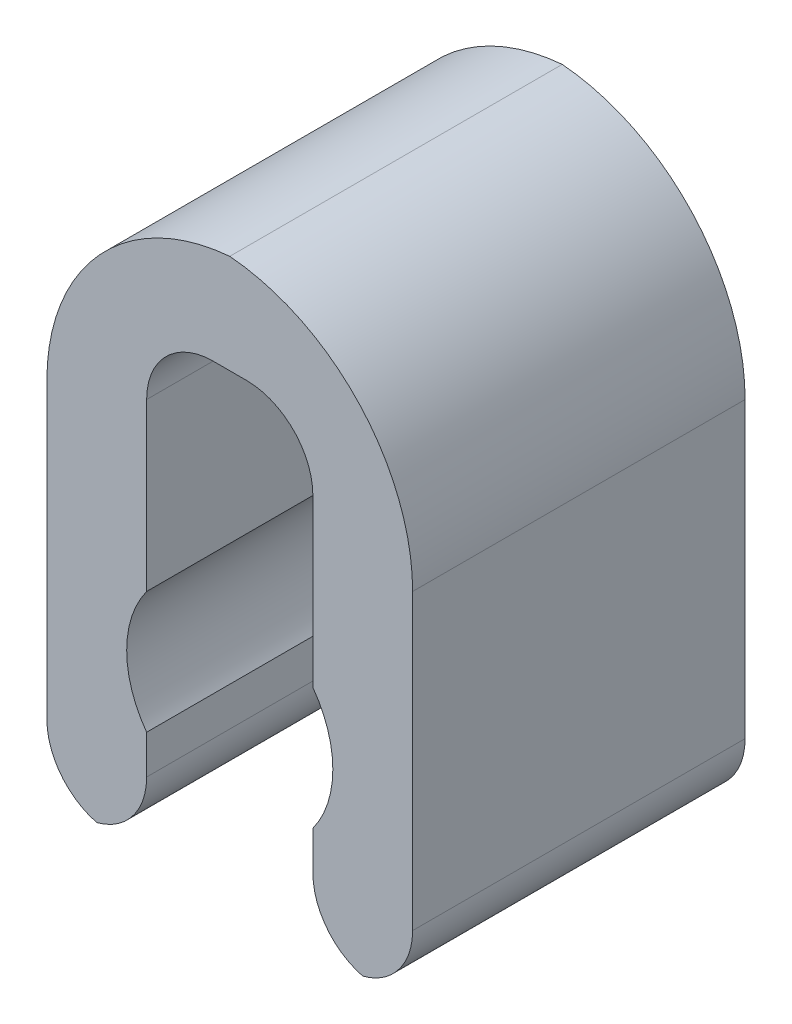
ISO-10303-21;
HEADER;
FILE_DESCRIPTION(('STEP AP214'),'2;1');
FILE_NAME('part.step','',(''),(''),'','','');
FILE_SCHEMA(('AUTOMOTIVE_DESIGN { 1 0 10303 214 1 1 1 1 }'));
ENDSEC;
DATA;
#1=APPLICATION_CONTEXT('core data for automotive mechanical design processes');
#2=APPLICATION_PROTOCOL_DEFINITION('international standard','automotive_design',2000,#1);
#3=PRODUCT_CONTEXT('',#1,'mechanical');
#4=PRODUCT('Part','Part','',(#3));
#5=PRODUCT_RELATED_PRODUCT_CATEGORY('part','',(#4));
#6=PRODUCT_DEFINITION_FORMATION('','',#4);
#7=PRODUCT_DEFINITION_CONTEXT('part definition',#1,'design');
#8=PRODUCT_DEFINITION('design','',#6,#7);
#9=PRODUCT_DEFINITION_SHAPE('','',#8);
#10=(LENGTH_UNIT() NAMED_UNIT(*) SI_UNIT(.MILLI.,.METRE.));
#11=(NAMED_UNIT(*) PLANE_ANGLE_UNIT() SI_UNIT($,.RADIAN.));
#12=(NAMED_UNIT(*) SI_UNIT($,.STERADIAN.) SOLID_ANGLE_UNIT());
#13=UNCERTAINTY_MEASURE_WITH_UNIT(LENGTH_MEASURE(1.E-05),#10,'distance_accuracy_value','');
#14=(GEOMETRIC_REPRESENTATION_CONTEXT(3) GLOBAL_UNCERTAINTY_ASSIGNED_CONTEXT((#13)) GLOBAL_UNIT_ASSIGNED_CONTEXT((#10,
#11,#12)) REPRESENTATION_CONTEXT('',''));
#15=CARTESIAN_POINT('',(0.,0.,0.));
#16=DIRECTION('',(0.,0.,1.));
#17=DIRECTION('',(1.,0.,0.));
#18=AXIS2_PLACEMENT_3D('',#15,#16,#17);
#19=CARTESIAN_POINT('',(-24.6711880482677,-4.34790209656009,10.));
#20=DIRECTION('',(0.,0.,-1.));
#21=DIRECTION('',(-1.,0.,0.));
#22=AXIS2_PLACEMENT_3D('',#19,#20,#21);
#23=CYLINDRICAL_SURFACE('',#22,3.1);
#24=CARTESIAN_POINT('',(-24.6711880482677,-4.34790209656009,0.));
#25=DIRECTION('',(0.,0.,1.));
#26=DIRECTION('',(1.,0.,0.));
#27=AXIS2_PLACEMENT_3D('',#24,#25,#26);
#28=CIRCLE('',#27,3.1);
#29=CARTESIAN_POINT('',(-27.1711880482677,-2.51487181857776,0.));
#30=VERTEX_POINT('',#29);
#31=CARTESIAN_POINT('',(-27.1711880482677,-6.18093237454243,0.));
#32=VERTEX_POINT('',#31);
#33=EDGE_CURVE('E166',#30,#32,#28,.T.);
#34=ORIENTED_EDGE('',*,*,#33,.F.);
#35=DIRECTION('',(0.,0.,-1.));
#36=VECTOR('',#35,1.);
#37=CARTESIAN_POINT('',(-27.1711880482677,-2.51487181857776,10.));
#38=LINE('',#37,#36);
#39=CARTESIAN_POINT('',(-27.1711880482677,-2.51487181857776,10.));
#40=VERTEX_POINT('',#39);
#41=EDGE_CURVE('E160',#40,#30,#38,.T.);
#42=ORIENTED_EDGE('',*,*,#41,.F.);
#43=CARTESIAN_POINT('',(-24.6711880482677,-4.34790209656009,10.));
#44=DIRECTION('',(0.,0.,1.));
#45=DIRECTION('',(1.,0.,0.));
#46=AXIS2_PLACEMENT_3D('',#43,#44,#45);
#47=CIRCLE('',#46,3.1);
#48=CARTESIAN_POINT('',(-27.1711880482677,-6.18093237454243,10.));
#49=VERTEX_POINT('',#48);
#50=EDGE_CURVE('E163',#40,#49,#47,.T.);
#51=ORIENTED_EDGE('',*,*,#50,.T.);
#52=DIRECTION('',(0.,0.,-1.));
#53=VECTOR('',#52,1.);
#54=CARTESIAN_POINT('',(-27.1711880482677,-6.18093237454243,10.));
#55=LINE('',#54,#53);
#56=EDGE_CURVE('E223',#49,#32,#55,.T.);
#57=ORIENTED_EDGE('',*,*,#56,.T.);
#58=EDGE_LOOP('',(#34,#42,#51,#57));
#59=FACE_BOUND('',#58,.T.);
#60=ADVANCED_FACE('F40',(#59),#23,.F.);
#61=CARTESIAN_POINT('',(-27.1711880482677,0.,10.));
#62=DIRECTION('',(-1.,0.,0.));
#63=DIRECTION('',(0.,0.,1.));
#64=AXIS2_PLACEMENT_3D('',#61,#62,#63);
#65=PLANE('',#64);
#66=DIRECTION('',(0.,1.,0.));
#67=VECTOR('',#66,1.);
#68=CARTESIAN_POINT('',(-27.1711880482677,0.,0.));
#69=LINE('',#68,#67);
#70=CARTESIAN_POINT('',(-27.1711880482677,2.48512818142224,0.));
#71=VERTEX_POINT('',#70);
#72=EDGE_CURVE('E226',#30,#71,#69,.T.);
#73=ORIENTED_EDGE('',*,*,#72,.T.);
#74=DIRECTION('',(0.,0.,-1.));
#75=VECTOR('',#74,1.);
#76=CARTESIAN_POINT('',(-27.1711880482677,2.48512818142224,10.));
#77=LINE('',#76,#75);
#78=CARTESIAN_POINT('',(-27.1711880482677,2.48512818142224,10.));
#79=VERTEX_POINT('',#78);
#80=EDGE_CURVE('E178',#71,#79,#77,.F.);
#81=ORIENTED_EDGE('',*,*,#80,.T.);
#82=DIRECTION('',(0.,1.,0.));
#83=VECTOR('',#82,1.);
#84=CARTESIAN_POINT('',(-27.1711880482677,0.,10.));
#85=LINE('',#84,#83);
#86=EDGE_CURVE('E175',#40,#79,#85,.T.);
#87=ORIENTED_EDGE('',*,*,#86,.F.);
#88=ORIENTED_EDGE('',*,*,#41,.T.);
#89=EDGE_LOOP('',(#73,#81,#87,#88));
#90=FACE_BOUND('',#89,.T.);
#91=ADVANCED_FACE('F176',(#90),#65,.F.);
#92=CARTESIAN_POINT('',(0.,4.48512818142224,10.));
#93=DIRECTION('',(0.,1.,0.));
#94=DIRECTION('',(0.,0.,1.));
#95=AXIS2_PLACEMENT_3D('',#92,#93,#94);
#96=PLANE('',#95);
#97=DIRECTION('',(1.,0.,0.));
#98=VECTOR('',#97,1.);
#99=CARTESIAN_POINT('',(0.,4.48512818142224,10.));
#100=LINE('',#99,#98);
#101=CARTESIAN_POINT('',(-25.1711880482677,4.48512818142224,10.));
#102=VERTEX_POINT('',#101);
#103=CARTESIAN_POINT('',(-24.1711880482677,4.48512818142224,10.));
#104=VERTEX_POINT('',#103);
#105=EDGE_CURVE('E181',#102,#104,#100,.T.);
#106=ORIENTED_EDGE('',*,*,#105,.F.);
#107=DIRECTION('',(0.,0.,-1.));
#108=VECTOR('',#107,1.);
#109=CARTESIAN_POINT('',(-25.1711880482677,4.48512818142224,0.));
#110=LINE('',#109,#108);
#111=CARTESIAN_POINT('',(-25.1711880482677,4.48512818142224,0.));
#112=VERTEX_POINT('',#111);
#113=EDGE_CURVE('E323',#102,#112,#110,.T.);
#114=ORIENTED_EDGE('',*,*,#113,.T.);
#115=DIRECTION('',(1.,0.,0.));
#116=VECTOR('',#115,1.);
#117=CARTESIAN_POINT('',(0.,4.48512818142224,0.));
#118=LINE('',#117,#116);
#119=CARTESIAN_POINT('',(-24.1711880482677,4.48512818142224,0.));
#120=VERTEX_POINT('',#119);
#121=EDGE_CURVE('E231',#112,#120,#118,.T.);
#122=ORIENTED_EDGE('',*,*,#121,.T.);
#123=DIRECTION('',(0.,0.,-1.));
#124=VECTOR('',#123,1.);
#125=CARTESIAN_POINT('',(-24.1711880482677,4.48512818142224,10.));
#126=LINE('',#125,#124);
#127=EDGE_CURVE('E313',#120,#104,#126,.F.);
#128=ORIENTED_EDGE('',*,*,#127,.T.);
#129=EDGE_LOOP('',(#106,#114,#122,#128));
#130=FACE_BOUND('',#129,.T.);
#131=ADVANCED_FACE('F345',(#130),#96,.F.);
#132=CARTESIAN_POINT('',(-22.1711880482677,0.,10.));
#133=DIRECTION('',(-1.,0.,0.));
#134=DIRECTION('',(0.,0.,1.));
#135=AXIS2_PLACEMENT_3D('',#132,#133,#134);
#136=PLANE('',#135);
#137=DIRECTION('',(0.,1.,0.));
#138=VECTOR('',#137,1.);
#139=CARTESIAN_POINT('',(-22.1711880482677,0.,10.));
#140=LINE('',#139,#138);
#141=CARTESIAN_POINT('',(-22.1711880482677,-2.51487181857776,10.));
#142=VERTEX_POINT('',#141);
#143=CARTESIAN_POINT('',(-22.1711880482677,2.48512818142224,10.));
#144=VERTEX_POINT('',#143);
#145=EDGE_CURVE('E198',#142,#144,#140,.T.);
#146=ORIENTED_EDGE('',*,*,#145,.T.);
#147=DIRECTION('',(0.,0.,-1.));
#148=VECTOR('',#147,1.);
#149=CARTESIAN_POINT('',(-22.1711880482677,2.48512818142224,10.));
#150=LINE('',#149,#148);
#151=CARTESIAN_POINT('',(-22.1711880482677,2.48512818142224,0.));
#152=VERTEX_POINT('',#151);
#153=EDGE_CURVE('E329',#144,#152,#150,.T.);
#154=ORIENTED_EDGE('',*,*,#153,.T.);
#155=DIRECTION('',(0.,1.,0.));
#156=VECTOR('',#155,1.);
#157=CARTESIAN_POINT('',(-22.1711880482677,0.,0.));
#158=LINE('',#157,#156);
#159=CARTESIAN_POINT('',(-22.1711880482677,-2.51487181857776,0.));
#160=VERTEX_POINT('',#159);
#161=EDGE_CURVE('E235',#160,#152,#158,.T.);
#162=ORIENTED_EDGE('',*,*,#161,.F.);
#163=DIRECTION('',(0.,0.,-1.));
#164=VECTOR('',#163,1.);
#165=CARTESIAN_POINT('',(-22.1711880482677,-2.51487181857776,10.));
#166=LINE('',#165,#164);
#167=EDGE_CURVE('E172',#142,#160,#166,.T.);
#168=ORIENTED_EDGE('',*,*,#167,.F.);
#169=EDGE_LOOP('',(#146,#154,#162,#168));
#170=FACE_BOUND('',#169,.T.);
#171=ADVANCED_FACE('F347',(#170),#136,.T.);
#172=CARTESIAN_POINT('',(-22.1711880482677,-6.18093237454243,0.));
#173=VERTEX_POINT('',#172);
#174=EDGE_CURVE('E228',#173,#160,#28,.T.);
#175=ORIENTED_EDGE('',*,*,#174,.F.);
#176=DIRECTION('',(0.,0.,-1.));
#177=VECTOR('',#176,1.);
#178=CARTESIAN_POINT('',(-22.1711880482677,-6.18093237454243,10.));
#179=LINE('',#178,#177);
#180=CARTESIAN_POINT('',(-22.1711880482677,-6.18093237454243,10.));
#181=VERTEX_POINT('',#180);
#182=EDGE_CURVE('E252',#181,#173,#179,.T.);
#183=ORIENTED_EDGE('',*,*,#182,.F.);
#184=EDGE_CURVE('E189',#181,#142,#47,.T.);
#185=ORIENTED_EDGE('',*,*,#184,.T.);
#186=ORIENTED_EDGE('',*,*,#167,.T.);
#187=EDGE_LOOP('',(#175,#183,#185,#186));
#188=FACE_BOUND('',#187,.T.);
#189=ADVANCED_FACE('F351',(#188),#23,.F.);
#190=CARTESIAN_POINT('',(-22.1711880482677,0.,10.));
#191=DIRECTION('',(1.,0.,0.));
#192=DIRECTION('',(0.,0.,-1.));
#193=AXIS2_PLACEMENT_3D('',#190,#191,#192);
#194=PLANE('',#193);
#195=DIRECTION('',(0.,-1.,0.));
#196=VECTOR('',#195,1.);
#197=CARTESIAN_POINT('',(-22.1711880482677,0.,0.));
#198=LINE('',#197,#196);
#199=CARTESIAN_POINT('',(-22.1711880482677,-7.34790209656009,0.));
#200=VERTEX_POINT('',#199);
#201=EDGE_CURVE('E239',#173,#200,#198,.T.);
#202=ORIENTED_EDGE('',*,*,#201,.T.);
#203=DIRECTION('',(0.,0.,-1.));
#204=VECTOR('',#203,1.);
#205=CARTESIAN_POINT('',(-22.1711880482677,-7.34790209656009,10.));
#206=LINE('',#205,#204);
#207=CARTESIAN_POINT('',(-22.1711880482677,-7.34790209656009,10.));
#208=VERTEX_POINT('',#207);
#209=EDGE_CURVE('E303',#200,#208,#206,.F.);
#210=ORIENTED_EDGE('',*,*,#209,.T.);
#211=DIRECTION('',(0.,-1.,0.));
#212=VECTOR('',#211,1.);
#213=CARTESIAN_POINT('',(-22.1711880482677,0.,10.));
#214=LINE('',#213,#212);
#215=EDGE_CURVE('E197',#181,#208,#214,.T.);
#216=ORIENTED_EDGE('',*,*,#215,.F.);
#217=ORIENTED_EDGE('',*,*,#182,.T.);
#218=EDGE_LOOP('',(#202,#210,#216,#217));
#219=FACE_BOUND('',#218,.T.);
#220=ADVANCED_FACE('F354',(#219),#194,.F.);
#221=CARTESIAN_POINT('',(-19.1711880482677,0.,10.));
#222=DIRECTION('',(1.,0.,0.));
#223=DIRECTION('',(0.,1.,0.));
#224=AXIS2_PLACEMENT_3D('',#221,#222,#223);
#225=PLANE('',#224);
#226=DIRECTION('',(0.,-1.,0.));
#227=VECTOR('',#226,1.);
#228=CARTESIAN_POINT('',(-19.1711880482677,0.,10.));
#229=LINE('',#228,#227);
#230=CARTESIAN_POINT('',(-19.1711880482677,1.48512818142224,10.));
#231=VERTEX_POINT('',#230);
#232=CARTESIAN_POINT('',(-19.1711880482677,-7.34790209656009,10.));
#233=VERTEX_POINT('',#232);
#234=EDGE_CURVE('E204',#231,#233,#229,.T.);
#235=ORIENTED_EDGE('',*,*,#234,.T.);
#236=DIRECTION('',(0.,0.,-1.));
#237=VECTOR('',#236,1.);
#238=CARTESIAN_POINT('',(-19.1711880482677,-7.34790209656009,0.));
#239=LINE('',#238,#237);
#240=CARTESIAN_POINT('',(-19.1711880482677,-7.34790209656009,0.));
#241=VERTEX_POINT('',#240);
#242=EDGE_CURVE('E273',#233,#241,#239,.T.);
#243=ORIENTED_EDGE('',*,*,#242,.T.);
#244=DIRECTION('',(0.,-1.,0.));
#245=VECTOR('',#244,1.);
#246=CARTESIAN_POINT('',(-19.1711880482677,0.,0.));
#247=LINE('',#246,#245);
#248=CARTESIAN_POINT('',(-19.1711880482677,1.48512818142224,0.));
#249=VERTEX_POINT('',#248);
#250=EDGE_CURVE('E243',#249,#241,#247,.T.);
#251=ORIENTED_EDGE('',*,*,#250,.F.);
#252=DIRECTION('',(0.,0.,-1.));
#253=VECTOR('',#252,1.);
#254=CARTESIAN_POINT('',(-19.1711880482677,1.48512818142224,10.));
#255=LINE('',#254,#253);
#256=EDGE_CURVE('E262',#249,#231,#255,.F.);
#257=ORIENTED_EDGE('',*,*,#256,.T.);
#258=EDGE_LOOP('',(#235,#243,#251,#257));
#259=FACE_BOUND('',#258,.T.);
#260=ADVANCED_FACE('F367',(#259),#225,.T.);
#261=CARTESIAN_POINT('',(-30.1711880482677,0.,10.));
#262=DIRECTION('',(1.,0.,0.));
#263=DIRECTION('',(0.,1.,0.));
#264=AXIS2_PLACEMENT_3D('',#261,#262,#263);
#265=PLANE('',#264);
#266=DIRECTION('',(0.,-1.,0.));
#267=VECTOR('',#266,1.);
#268=CARTESIAN_POINT('',(-30.1711880482677,0.,0.));
#269=LINE('',#268,#267);
#270=CARTESIAN_POINT('',(-30.1711880482677,1.48512818142224,0.));
#271=VERTEX_POINT('',#270);
#272=CARTESIAN_POINT('',(-30.1711880482677,-7.34790209656009,0.));
#273=VERTEX_POINT('',#272);
#274=EDGE_CURVE('E193',#271,#273,#269,.T.);
#275=ORIENTED_EDGE('',*,*,#274,.T.);
#276=DIRECTION('',(0.,0.,-1.));
#277=VECTOR('',#276,1.);
#278=CARTESIAN_POINT('',(-30.1711880482677,-7.34790209656009,10.));
#279=LINE('',#278,#277);
#280=CARTESIAN_POINT('',(-30.1711880482677,-7.34790209656009,10.));
#281=VERTEX_POINT('',#280);
#282=EDGE_CURVE('E310',#273,#281,#279,.F.);
#283=ORIENTED_EDGE('',*,*,#282,.T.);
#284=DIRECTION('',(0.,-1.,0.));
#285=VECTOR('',#284,1.);
#286=CARTESIAN_POINT('',(-30.1711880482677,0.,10.));
#287=LINE('',#286,#285);
#288=CARTESIAN_POINT('',(-30.1711880482677,1.48512818142224,10.));
#289=VERTEX_POINT('',#288);
#290=EDGE_CURVE('E217',#289,#281,#287,.T.);
#291=ORIENTED_EDGE('',*,*,#290,.F.);
#292=DIRECTION('',(0.,0.,-1.));
#293=VECTOR('',#292,1.);
#294=CARTESIAN_POINT('',(-30.1711880482677,1.48512818142224,0.));
#295=LINE('',#294,#293);
#296=EDGE_CURVE('E270',#289,#271,#295,.T.);
#297=ORIENTED_EDGE('',*,*,#296,.T.);
#298=EDGE_LOOP('',(#275,#283,#291,#297));
#299=FACE_BOUND('',#298,.T.);
#300=ADVANCED_FACE('F382',(#299),#265,.F.);
#301=CARTESIAN_POINT('',(-27.1711880482677,0.,10.));
#302=DIRECTION('',(1.,0.,0.));
#303=DIRECTION('',(0.,0.,-1.));
#304=AXIS2_PLACEMENT_3D('',#301,#302,#303);
#305=PLANE('',#304);
#306=DIRECTION('',(0.,-1.,0.));
#307=VECTOR('',#306,1.);
#308=CARTESIAN_POINT('',(-27.1711880482677,0.,10.));
#309=LINE('',#308,#307);
#310=CARTESIAN_POINT('',(-27.1711880482677,-7.34790209656009,10.));
#311=VERTEX_POINT('',#310);
#312=EDGE_CURVE('E185',#49,#311,#309,.T.);
#313=ORIENTED_EDGE('',*,*,#312,.T.);
#314=DIRECTION('',(0.,0.,-1.));
#315=VECTOR('',#314,1.);
#316=CARTESIAN_POINT('',(-27.1711880482677,-7.34790209656009,0.));
#317=LINE('',#316,#315);
#318=CARTESIAN_POINT('',(-27.1711880482677,-7.34790209656009,0.));
#319=VERTEX_POINT('',#318);
#320=EDGE_CURVE('E306',#311,#319,#317,.T.);
#321=ORIENTED_EDGE('',*,*,#320,.T.);
#322=DIRECTION('',(0.,-1.,0.));
#323=VECTOR('',#322,1.);
#324=CARTESIAN_POINT('',(-27.1711880482677,0.,0.));
#325=LINE('',#324,#323);
#326=EDGE_CURVE('E187',#32,#319,#325,.T.);
#327=ORIENTED_EDGE('',*,*,#326,.F.);
#328=ORIENTED_EDGE('',*,*,#56,.F.);
#329=EDGE_LOOP('',(#313,#321,#327,#328));
#330=FACE_BOUND('',#329,.T.);
#331=ADVANCED_FACE('F394',(#330),#305,.T.);
#332=CARTESIAN_POINT('',(0.,0.,10.));
#333=DIRECTION('',(0.,0.,1.));
#334=DIRECTION('',(1.,0.,0.));
#335=AXIS2_PLACEMENT_3D('',#332,#333,#334);
#336=PLANE('',#335);
#337=CARTESIAN_POINT('',(-20.1711880482677,-7.34790209656009,10.));
#338=DIRECTION('',(0.,0.,1.));
#339=DIRECTION('',(1.,0.,0.));
#340=AXIS2_PLACEMENT_3D('',#337,#338,#339);
#341=CIRCLE('',#340,2.);
#342=CARTESIAN_POINT('',(-20.6711880482677,-9.2843937696638,10.));
#343=VERTEX_POINT('',#342);
#344=EDGE_CURVE('E297',#208,#343,#341,.T.);
#345=ORIENTED_EDGE('',*,*,#344,.T.);
#346=CARTESIAN_POINT('',(-21.1711880482677,-7.34790209656009,10.));
#347=DIRECTION('',(0.,0.,1.));
#348=DIRECTION('',(1.,0.,0.));
#349=AXIS2_PLACEMENT_3D('',#346,#347,#348);
#350=CIRCLE('',#349,2.);
#351=EDGE_CURVE('E300',#343,#233,#350,.T.);
#352=ORIENTED_EDGE('',*,*,#351,.T.);
#353=ORIENTED_EDGE('',*,*,#234,.F.);
#354=CARTESIAN_POINT('',(-25.1711880482677,1.48512818142224,10.));
#355=DIRECTION('',(0.,0.,1.));
#356=DIRECTION('',(1.,0.,0.));
#357=AXIS2_PLACEMENT_3D('',#354,#355,#356);
#358=CIRCLE('',#357,6.);
#359=CARTESIAN_POINT('',(-24.6711880482677,7.46425855297294,10.));
#360=VERTEX_POINT('',#359);
#361=EDGE_CURVE('E267',#231,#360,#358,.T.);
#362=ORIENTED_EDGE('',*,*,#361,.T.);
#363=CARTESIAN_POINT('',(-24.1711880482677,1.48512818142224,10.));
#364=DIRECTION('',(0.,0.,1.));
#365=DIRECTION('',(1.,0.,0.));
#366=AXIS2_PLACEMENT_3D('',#363,#364,#365);
#367=CIRCLE('',#366,6.);
#368=EDGE_CURVE('E265',#360,#289,#367,.T.);
#369=ORIENTED_EDGE('',*,*,#368,.T.);
#370=ORIENTED_EDGE('',*,*,#290,.T.);
#371=CARTESIAN_POINT('',(-28.1711880482677,-7.34790209656009,10.));
#372=DIRECTION('',(0.,0.,1.));
#373=DIRECTION('',(1.,0.,0.));
#374=AXIS2_PLACEMENT_3D('',#371,#372,#373);
#375=CIRCLE('',#374,2.);
#376=CARTESIAN_POINT('',(-28.6711880482677,-9.2843937696638,10.));
#377=VERTEX_POINT('',#376);
#378=EDGE_CURVE('E291',#281,#377,#375,.T.);
#379=ORIENTED_EDGE('',*,*,#378,.T.);
#380=CARTESIAN_POINT('',(-29.1711880482677,-7.34790209656009,10.));
#381=DIRECTION('',(0.,0.,1.));
#382=DIRECTION('',(1.,0.,0.));
#383=AXIS2_PLACEMENT_3D('',#380,#381,#382);
#384=CIRCLE('',#383,2.);
#385=EDGE_CURVE('E294',#377,#311,#384,.T.);
#386=ORIENTED_EDGE('',*,*,#385,.T.);
#387=ORIENTED_EDGE('',*,*,#312,.F.);
#388=ORIENTED_EDGE('',*,*,#50,.F.);
#389=ORIENTED_EDGE('',*,*,#86,.T.);
#390=CARTESIAN_POINT('',(-25.1711880482677,2.48512818142224,10.));
#391=DIRECTION('',(0.,0.,1.));
#392=DIRECTION('',(1.,0.,0.));
#393=AXIS2_PLACEMENT_3D('',#390,#391,#392);
#394=CIRCLE('',#393,2.);
#395=EDGE_CURVE('E335',#79,#102,#394,.F.);
#396=ORIENTED_EDGE('',*,*,#395,.T.);
#397=ORIENTED_EDGE('',*,*,#105,.T.);
#398=CARTESIAN_POINT('',(-24.1711880482677,2.48512818142224,10.));
#399=DIRECTION('',(0.,0.,1.));
#400=DIRECTION('',(1.,0.,0.));
#401=AXIS2_PLACEMENT_3D('',#398,#399,#400);
#402=CIRCLE('',#401,2.);
#403=EDGE_CURVE('E11',#104,#144,#402,.F.);
#404=ORIENTED_EDGE('',*,*,#403,.T.);
#405=ORIENTED_EDGE('',*,*,#145,.F.);
#406=ORIENTED_EDGE('',*,*,#184,.F.);
#407=ORIENTED_EDGE('',*,*,#215,.T.);
#408=EDGE_LOOP('',(#345,#352,#353,#362,#369,#370,#379,#386,#387,#388,#389,#396,#397,#404,#405,
#406,#407));
#409=FACE_BOUND('',#408,.T.);
#410=ADVANCED_FACE('F183',(#409),#336,.T.);
#411=CARTESIAN_POINT('',(0.,0.,0.));
#412=DIRECTION('',(0.,0.,1.));
#413=DIRECTION('',(1.,0.,0.));
#414=AXIS2_PLACEMENT_3D('',#411,#412,#413);
#415=PLANE('',#414);
#416=ORIENTED_EDGE('',*,*,#250,.T.);
#417=CARTESIAN_POINT('',(-21.1711880482677,-7.34790209656009,0.));
#418=DIRECTION('',(0.,0.,1.));
#419=DIRECTION('',(1.,0.,0.));
#420=AXIS2_PLACEMENT_3D('',#417,#418,#419);
#421=CIRCLE('',#420,2.);
#422=CARTESIAN_POINT('',(-20.6711880482677,-9.2843937696638,0.));
#423=VERTEX_POINT('',#422);
#424=EDGE_CURVE('E288',#241,#423,#421,.F.);
#425=ORIENTED_EDGE('',*,*,#424,.T.);
#426=CARTESIAN_POINT('',(-20.1711880482677,-7.34790209656009,0.));
#427=DIRECTION('',(0.,0.,1.));
#428=DIRECTION('',(1.,0.,0.));
#429=AXIS2_PLACEMENT_3D('',#426,#427,#428);
#430=CIRCLE('',#429,2.);
#431=EDGE_CURVE('E285',#423,#200,#430,.F.);
#432=ORIENTED_EDGE('',*,*,#431,.T.);
#433=ORIENTED_EDGE('',*,*,#201,.F.);
#434=ORIENTED_EDGE('',*,*,#174,.T.);
#435=ORIENTED_EDGE('',*,*,#161,.T.);
#436=CARTESIAN_POINT('',(-24.1711880482677,2.48512818142224,0.));
#437=DIRECTION('',(0.,0.,1.));
#438=DIRECTION('',(1.,0.,0.));
#439=AXIS2_PLACEMENT_3D('',#436,#437,#438);
#440=CIRCLE('',#439,2.);
#441=EDGE_CURVE('E49',#152,#120,#440,.T.);
#442=ORIENTED_EDGE('',*,*,#441,.T.);
#443=ORIENTED_EDGE('',*,*,#121,.F.);
#444=CARTESIAN_POINT('',(-25.1711880482677,2.48512818142224,0.));
#445=DIRECTION('',(0.,0.,1.));
#446=DIRECTION('',(1.,0.,0.));
#447=AXIS2_PLACEMENT_3D('',#444,#445,#446);
#448=CIRCLE('',#447,2.);
#449=EDGE_CURVE('E332',#112,#71,#448,.T.);
#450=ORIENTED_EDGE('',*,*,#449,.T.);
#451=ORIENTED_EDGE('',*,*,#72,.F.);
#452=ORIENTED_EDGE('',*,*,#33,.T.);
#453=ORIENTED_EDGE('',*,*,#326,.T.);
#454=CARTESIAN_POINT('',(-29.1711880482677,-7.34790209656009,0.));
#455=DIRECTION('',(0.,0.,1.));
#456=DIRECTION('',(1.,0.,0.));
#457=AXIS2_PLACEMENT_3D('',#454,#455,#456);
#458=CIRCLE('',#457,2.);
#459=CARTESIAN_POINT('',(-28.6711880482677,-9.2843937696638,0.));
#460=VERTEX_POINT('',#459);
#461=EDGE_CURVE('E282',#319,#460,#458,.F.);
#462=ORIENTED_EDGE('',*,*,#461,.T.);
#463=CARTESIAN_POINT('',(-28.1711880482677,-7.34790209656009,0.));
#464=DIRECTION('',(0.,0.,1.));
#465=DIRECTION('',(1.,0.,0.));
#466=AXIS2_PLACEMENT_3D('',#463,#464,#465);
#467=CIRCLE('',#466,2.);
#468=EDGE_CURVE('E279',#460,#273,#467,.F.);
#469=ORIENTED_EDGE('',*,*,#468,.T.);
#470=ORIENTED_EDGE('',*,*,#274,.F.);
#471=CARTESIAN_POINT('',(-24.1711880482677,1.48512818142224,0.));
#472=DIRECTION('',(0.,0.,1.));
#473=DIRECTION('',(1.,0.,0.));
#474=AXIS2_PLACEMENT_3D('',#471,#472,#473);
#475=CIRCLE('',#474,6.);
#476=CARTESIAN_POINT('',(-24.6711880482677,7.46425855297294,0.));
#477=VERTEX_POINT('',#476);
#478=EDGE_CURVE('E171',#271,#477,#475,.F.);
#479=ORIENTED_EDGE('',*,*,#478,.T.);
#480=CARTESIAN_POINT('',(-25.1711880482677,1.48512818142224,0.));
#481=DIRECTION('',(0.,0.,1.));
#482=DIRECTION('',(1.,0.,0.));
#483=AXIS2_PLACEMENT_3D('',#480,#481,#482);
#484=CIRCLE('',#483,6.);
#485=EDGE_CURVE('E259',#477,#249,#484,.F.);
#486=ORIENTED_EDGE('',*,*,#485,.T.);
#487=EDGE_LOOP('',(#416,#425,#432,#433,#434,#435,#442,#443,#450,#451,#452,#453,#462,#469,#470,
#479,#486));
#488=FACE_BOUND('',#487,.T.);
#489=ADVANCED_FACE('F340',(#488),#415,.F.);
#490=CARTESIAN_POINT('',(-24.1711880482677,1.48512818142224,10.));
#491=DIRECTION('',(0.,0.,1.));
#492=DIRECTION('',(1.,0.,0.));
#493=AXIS2_PLACEMENT_3D('',#490,#491,#492);
#494=CYLINDRICAL_SURFACE('',#493,6.);
#495=ORIENTED_EDGE('',*,*,#296,.F.);
#496=ORIENTED_EDGE('',*,*,#368,.F.);
#497=DIRECTION('',(0.,0.,1.));
#498=VECTOR('',#497,1.);
#499=CARTESIAN_POINT('',(-24.6711880482677,7.46425855297294,5.));
#500=LINE('',#499,#498);
#501=EDGE_CURVE('E227',#477,#360,#500,.T.);
#502=ORIENTED_EDGE('',*,*,#501,.F.);
#503=ORIENTED_EDGE('',*,*,#478,.F.);
#504=EDGE_LOOP('',(#495,#496,#502,#503));
#505=FACE_BOUND('',#504,.T.);
#506=ADVANCED_FACE('F378',(#505),#494,.T.);
#507=CARTESIAN_POINT('',(-25.1711880482677,1.48512818142224,10.));
#508=DIRECTION('',(0.,0.,-1.));
#509=DIRECTION('',(-1.,0.,0.));
#510=AXIS2_PLACEMENT_3D('',#507,#508,#509);
#511=CYLINDRICAL_SURFACE('',#510,6.);
#512=ORIENTED_EDGE('',*,*,#361,.F.);
#513=ORIENTED_EDGE('',*,*,#256,.F.);
#514=ORIENTED_EDGE('',*,*,#485,.F.);
#515=ORIENTED_EDGE('',*,*,#501,.T.);
#516=EDGE_LOOP('',(#512,#513,#514,#515));
#517=FACE_BOUND('',#516,.T.);
#518=ADVANCED_FACE('F372',(#517),#511,.T.);
#519=CARTESIAN_POINT('',(-20.1711880482677,-7.34790209656009,10.));
#520=DIRECTION('',(0.,0.,-1.));
#521=DIRECTION('',(-1.,0.,0.));
#522=AXIS2_PLACEMENT_3D('',#519,#520,#521);
#523=CYLINDRICAL_SURFACE('',#522,2.);
#524=DIRECTION('',(0.,0.,-1.));
#525=VECTOR('',#524,1.);
#526=CARTESIAN_POINT('',(-20.6711880482677,-9.2843937696638,5.));
#527=LINE('',#526,#525);
#528=EDGE_CURVE('E276',#343,#423,#527,.T.);
#529=ORIENTED_EDGE('',*,*,#528,.F.);
#530=ORIENTED_EDGE('',*,*,#344,.F.);
#531=ORIENTED_EDGE('',*,*,#209,.F.);
#532=ORIENTED_EDGE('',*,*,#431,.F.);
#533=EDGE_LOOP('',(#529,#530,#531,#532));
#534=FACE_BOUND('',#533,.T.);
#535=ADVANCED_FACE('F359',(#534),#523,.T.);
#536=CARTESIAN_POINT('',(-21.1711880482677,-7.34790209656009,10.));
#537=DIRECTION('',(0.,0.,1.));
#538=DIRECTION('',(1.,0.,0.));
#539=AXIS2_PLACEMENT_3D('',#536,#537,#538);
#540=CYLINDRICAL_SURFACE('',#539,2.);
#541=ORIENTED_EDGE('',*,*,#351,.F.);
#542=ORIENTED_EDGE('',*,*,#528,.T.);
#543=ORIENTED_EDGE('',*,*,#424,.F.);
#544=ORIENTED_EDGE('',*,*,#242,.F.);
#545=EDGE_LOOP('',(#541,#542,#543,#544));
#546=FACE_BOUND('',#545,.T.);
#547=ADVANCED_FACE('F364',(#546),#540,.T.);
#548=CARTESIAN_POINT('',(-28.1711880482677,-7.34790209656009,10.));
#549=DIRECTION('',(0.,0.,-1.));
#550=DIRECTION('',(-1.,0.,0.));
#551=AXIS2_PLACEMENT_3D('',#548,#549,#550);
#552=CYLINDRICAL_SURFACE('',#551,2.);
#553=DIRECTION('',(0.,0.,-1.));
#554=VECTOR('',#553,1.);
#555=CARTESIAN_POINT('',(-28.6711880482677,-9.2843937696638,5.));
#556=LINE('',#555,#554);
#557=EDGE_CURVE('E317',#377,#460,#556,.T.);
#558=ORIENTED_EDGE('',*,*,#557,.F.);
#559=ORIENTED_EDGE('',*,*,#378,.F.);
#560=ORIENTED_EDGE('',*,*,#282,.F.);
#561=ORIENTED_EDGE('',*,*,#468,.F.);
#562=EDGE_LOOP('',(#558,#559,#560,#561));
#563=FACE_BOUND('',#562,.T.);
#564=ADVANCED_FACE('F387',(#563),#552,.T.);
#565=CARTESIAN_POINT('',(-29.1711880482677,-7.34790209656009,10.));
#566=DIRECTION('',(0.,0.,1.));
#567=DIRECTION('',(1.,0.,0.));
#568=AXIS2_PLACEMENT_3D('',#565,#566,#567);
#569=CYLINDRICAL_SURFACE('',#568,2.);
#570=ORIENTED_EDGE('',*,*,#385,.F.);
#571=ORIENTED_EDGE('',*,*,#557,.T.);
#572=ORIENTED_EDGE('',*,*,#461,.F.);
#573=ORIENTED_EDGE('',*,*,#320,.F.);
#574=EDGE_LOOP('',(#570,#571,#572,#573));
#575=FACE_BOUND('',#574,.T.);
#576=ADVANCED_FACE('F391',(#575),#569,.T.);
#577=CARTESIAN_POINT('',(-25.1711880482677,2.48512818142224,10.));
#578=DIRECTION('',(0.,0.,1.));
#579=DIRECTION('',(1.,0.,0.));
#580=AXIS2_PLACEMENT_3D('',#577,#578,#579);
#581=CYLINDRICAL_SURFACE('',#580,2.);
#582=ORIENTED_EDGE('',*,*,#395,.F.);
#583=ORIENTED_EDGE('',*,*,#80,.F.);
#584=ORIENTED_EDGE('',*,*,#449,.F.);
#585=ORIENTED_EDGE('',*,*,#113,.F.);
#586=EDGE_LOOP('',(#582,#583,#584,#585));
#587=FACE_BOUND('',#586,.T.);
#588=ADVANCED_FACE('F397',(#587),#581,.F.);
#589=CARTESIAN_POINT('',(-24.1711880482677,2.48512818142224,10.));
#590=DIRECTION('',(0.,0.,-1.));
#591=DIRECTION('',(-1.,0.,0.));
#592=AXIS2_PLACEMENT_3D('',#589,#590,#591);
#593=CYLINDRICAL_SURFACE('',#592,2.);
#594=ORIENTED_EDGE('',*,*,#403,.F.);
#595=ORIENTED_EDGE('',*,*,#127,.F.);
#596=ORIENTED_EDGE('',*,*,#441,.F.);
#597=ORIENTED_EDGE('',*,*,#153,.F.);
#598=EDGE_LOOP('',(#594,#595,#596,#597));
#599=FACE_BOUND('',#598,.T.);
#600=ADVANCED_FACE('F42',(#599),#593,.F.);
#601=CLOSED_SHELL('',(#60,#91,#131,#171,#189,#220,#260,#300,#331,#410,#489,#506,#518,#535,#547,
#564,#576,#588,#600));
#602=MANIFOLD_SOLID_BREP('B2',#601);
#603=ADVANCED_BREP_SHAPE_REPRESENTATION('',(#18,#602),#14);
#604=SHAPE_DEFINITION_REPRESENTATION(#9,#603);
ENDSEC;
END-ISO-10303-21;
